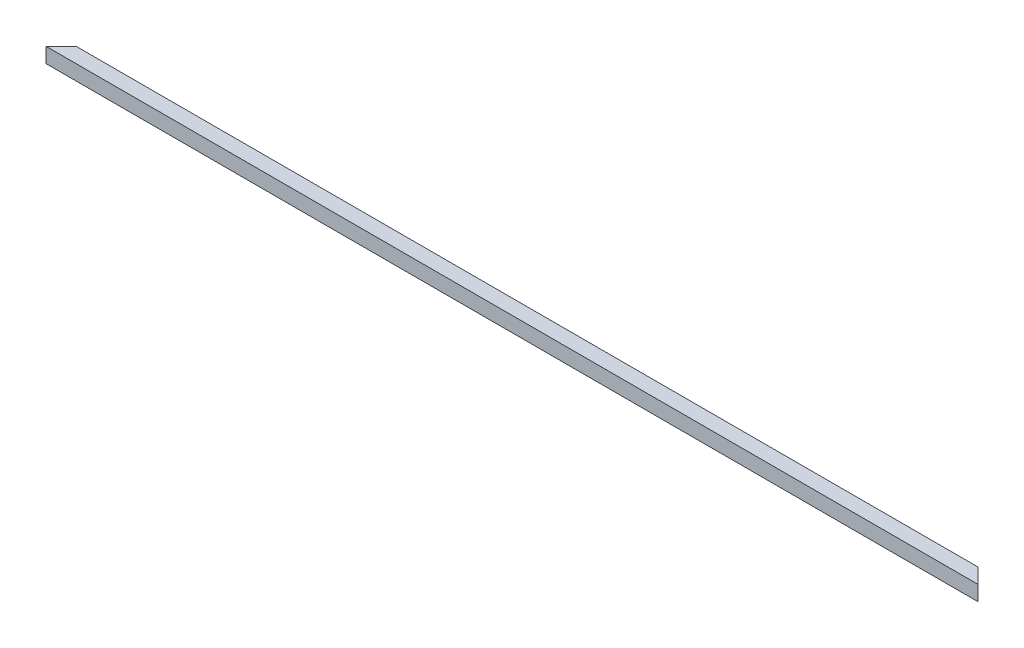
ISO-10303-21;
HEADER;
FILE_DESCRIPTION(('STEP AP214'),'2;1');
FILE_NAME('part.step','',(''),(''),'','','');
FILE_SCHEMA(('AUTOMOTIVE_DESIGN { 1 0 10303 214 1 1 1 1 }'));
ENDSEC;
DATA;
#1=APPLICATION_CONTEXT('core data for automotive mechanical design processes');
#2=APPLICATION_PROTOCOL_DEFINITION('international standard','automotive_design',2000,#1);
#3=PRODUCT_CONTEXT('',#1,'mechanical');
#4=PRODUCT('Part','Part','',(#3));
#5=PRODUCT_RELATED_PRODUCT_CATEGORY('part','',(#4));
#6=PRODUCT_DEFINITION_FORMATION('','',#4);
#7=PRODUCT_DEFINITION_CONTEXT('part definition',#1,'design');
#8=PRODUCT_DEFINITION('design','',#6,#7);
#9=PRODUCT_DEFINITION_SHAPE('','',#8);
#10=(LENGTH_UNIT() NAMED_UNIT(*) SI_UNIT(.MILLI.,.METRE.));
#11=(NAMED_UNIT(*) PLANE_ANGLE_UNIT() SI_UNIT($,.RADIAN.));
#12=(NAMED_UNIT(*) SI_UNIT($,.STERADIAN.) SOLID_ANGLE_UNIT());
#13=UNCERTAINTY_MEASURE_WITH_UNIT(LENGTH_MEASURE(1.E-05),#10,'distance_accuracy_value','');
#14=(GEOMETRIC_REPRESENTATION_CONTEXT(3) GLOBAL_UNCERTAINTY_ASSIGNED_CONTEXT((#13)) GLOBAL_UNIT_ASSIGNED_CONTEXT((#10,
#11,#12)) REPRESENTATION_CONTEXT('',''));
#15=CARTESIAN_POINT('',(0.,0.,0.));
#16=DIRECTION('',(0.,0.,1.));
#17=DIRECTION('',(1.,0.,0.));
#18=AXIS2_PLACEMENT_3D('',#15,#16,#17);
#19=CARTESIAN_POINT('',(1574.8,-12.7,-12.7));
#20=DIRECTION('',(0.,0.,1.));
#21=DIRECTION('',(1.,0.,0.));
#22=AXIS2_PLACEMENT_3D('',#19,#20,#21);
#23=PLANE('',#22);
#24=DIRECTION('',(0.,1.,0.));
#25=VECTOR('',#24,1.);
#26=CARTESIAN_POINT('',(1549.4,-12.7,-12.7));
#27=LINE('',#26,#25);
#28=CARTESIAN_POINT('',(1549.4,-12.7,-12.7));
#29=VERTEX_POINT('',#28);
#30=CARTESIAN_POINT('',(1549.4,12.7,-12.7));
#31=VERTEX_POINT('',#30);
#32=EDGE_CURVE('E98',#29,#31,#27,.T.);
#33=ORIENTED_EDGE('',*,*,#32,.F.);
#34=DIRECTION('',(-1.,0.,0.));
#35=VECTOR('',#34,1.);
#36=CARTESIAN_POINT('',(1574.8,-12.7,-12.7));
#37=LINE('',#36,#35);
#38=CARTESIAN_POINT('',(25.4000000000005,-12.7,-12.7000000000001));
#39=VERTEX_POINT('',#38);
#40=EDGE_CURVE('E53',#29,#39,#37,.T.);
#41=ORIENTED_EDGE('',*,*,#40,.T.);
#42=DIRECTION('',(0.,1.,0.));
#43=VECTOR('',#42,1.);
#44=CARTESIAN_POINT('',(25.4,-12.7,-12.7));
#45=LINE('',#44,#43);
#46=CARTESIAN_POINT('',(25.4,12.7,-12.7));
#47=VERTEX_POINT('',#46);
#48=EDGE_CURVE('E165',#39,#47,#45,.T.);
#49=ORIENTED_EDGE('',*,*,#48,.T.);
#50=DIRECTION('',(-1.,0.,0.));
#51=VECTOR('',#50,1.);
#52=CARTESIAN_POINT('',(1574.8,12.7,-12.7));
#53=LINE('',#52,#51);
#54=EDGE_CURVE('E108',#31,#47,#53,.T.);
#55=ORIENTED_EDGE('',*,*,#54,.F.);
#56=EDGE_LOOP('',(#33,#41,#49,#55));
#57=FACE_BOUND('',#56,.T.);
#58=ADVANCED_FACE('F32',(#57),#23,.F.);
#59=CARTESIAN_POINT('',(1574.8,12.7,12.7));
#60=DIRECTION('',(0.,-1.,0.));
#61=DIRECTION('',(0.,0.,-1.));
#62=AXIS2_PLACEMENT_3D('',#59,#60,#61);
#63=PLANE('',#62);
#64=DIRECTION('',(-0.707106781186547,0.,-0.707106781186547));
#65=VECTOR('',#64,1.);
#66=CARTESIAN_POINT('',(1574.8,12.7,12.7));
#67=LINE('',#66,#65);
#68=CARTESIAN_POINT('',(1574.8,12.7,12.7));
#69=VERTEX_POINT('',#68);
#70=EDGE_CURVE('E105',#69,#31,#67,.T.);
#71=ORIENTED_EDGE('',*,*,#70,.T.);
#72=ORIENTED_EDGE('',*,*,#54,.T.);
#73=DIRECTION('',(0.707106781186547,0.,-0.707106781186547));
#74=VECTOR('',#73,1.);
#75=CARTESIAN_POINT('',(0.,12.7,12.7));
#76=LINE('',#75,#74);
#77=CARTESIAN_POINT('',(0.,12.7,12.7));
#78=VERTEX_POINT('',#77);
#79=EDGE_CURVE('E161',#78,#47,#76,.T.);
#80=ORIENTED_EDGE('',*,*,#79,.F.);
#81=DIRECTION('',(-1.,0.,0.));
#82=VECTOR('',#81,1.);
#83=CARTESIAN_POINT('',(1574.8,12.7,12.7));
#84=LINE('',#83,#82);
#85=EDGE_CURVE('E116',#69,#78,#84,.T.);
#86=ORIENTED_EDGE('',*,*,#85,.F.);
#87=EDGE_LOOP('',(#71,#72,#80,#86));
#88=FACE_BOUND('',#87,.T.);
#89=ADVANCED_FACE('F163',(#88),#63,.F.);
#90=CARTESIAN_POINT('',(1574.8,-12.7,12.7));
#91=DIRECTION('',(0.,1.,0.));
#92=DIRECTION('',(0.,0.,1.));
#93=AXIS2_PLACEMENT_3D('',#90,#91,#92);
#94=PLANE('',#93);
#95=DIRECTION('',(-0.707106781186547,0.,-0.707106781186547));
#96=VECTOR('',#95,1.);
#97=CARTESIAN_POINT('',(1574.8,-12.7,12.7));
#98=LINE('',#97,#96);
#99=CARTESIAN_POINT('',(1574.8,-12.7,12.7));
#100=VERTEX_POINT('',#99);
#101=EDGE_CURVE('E96',#100,#29,#98,.T.);
#102=ORIENTED_EDGE('',*,*,#101,.F.);
#103=DIRECTION('',(-1.,0.,0.));
#104=VECTOR('',#103,1.);
#105=CARTESIAN_POINT('',(1574.8,-12.7,12.7));
#106=LINE('',#105,#104);
#107=CARTESIAN_POINT('',(0.,-12.7,12.7));
#108=VERTEX_POINT('',#107);
#109=EDGE_CURVE('E114',#100,#108,#106,.T.);
#110=ORIENTED_EDGE('',*,*,#109,.T.);
#111=DIRECTION('',(0.707106781186547,0.,-0.707106781186547));
#112=VECTOR('',#111,1.);
#113=CARTESIAN_POINT('',(0.,-12.7,12.7));
#114=LINE('',#113,#112);
#115=EDGE_CURVE('E113',#108,#39,#114,.T.);
#116=ORIENTED_EDGE('',*,*,#115,.T.);
#117=ORIENTED_EDGE('',*,*,#40,.F.);
#118=EDGE_LOOP('',(#102,#110,#116,#117));
#119=FACE_BOUND('',#118,.T.);
#120=ADVANCED_FACE('F112',(#119),#94,.F.);
#121=CARTESIAN_POINT('',(1574.8,-11.1125,-11.1125));
#122=DIRECTION('',(0.,0.,1.));
#123=DIRECTION('',(1.,0.,0.));
#124=AXIS2_PLACEMENT_3D('',#121,#122,#123);
#125=PLANE('',#124);
#126=DIRECTION('',(-1.,0.,0.));
#127=VECTOR('',#126,1.);
#128=CARTESIAN_POINT('',(1574.8,-11.1125,-11.1125));
#129=LINE('',#128,#127);
#130=CARTESIAN_POINT('',(1550.9875,-11.1125,-11.1125));
#131=VERTEX_POINT('',#130);
#132=CARTESIAN_POINT('',(23.8124999999998,-11.1125,-11.1125));
#133=VERTEX_POINT('',#132);
#134=EDGE_CURVE('E142',#131,#133,#129,.T.);
#135=ORIENTED_EDGE('',*,*,#134,.F.);
#136=DIRECTION('',(0.,1.,0.));
#137=VECTOR('',#136,1.);
#138=CARTESIAN_POINT('',(1550.9875,-11.1125,-11.1125));
#139=LINE('',#138,#137);
#140=CARTESIAN_POINT('',(1550.9875,11.1125,-11.1125));
#141=VERTEX_POINT('',#140);
#142=EDGE_CURVE('E46',#131,#141,#139,.T.);
#143=ORIENTED_EDGE('',*,*,#142,.T.);
#144=DIRECTION('',(-1.,0.,0.));
#145=VECTOR('',#144,1.);
#146=CARTESIAN_POINT('',(1574.8,11.1125,-11.1125));
#147=LINE('',#146,#145);
#148=CARTESIAN_POINT('',(23.8124999999998,11.1125,-11.1125));
#149=VERTEX_POINT('',#148);
#150=EDGE_CURVE('E144',#141,#149,#147,.T.);
#151=ORIENTED_EDGE('',*,*,#150,.T.);
#152=DIRECTION('',(0.,1.,0.));
#153=VECTOR('',#152,1.);
#154=CARTESIAN_POINT('',(23.8124999999998,-11.1125,-11.1125));
#155=LINE('',#154,#153);
#156=EDGE_CURVE('E133',#133,#149,#155,.T.);
#157=ORIENTED_EDGE('',*,*,#156,.F.);
#158=EDGE_LOOP('',(#135,#143,#151,#157));
#159=FACE_BOUND('',#158,.T.);
#160=ADVANCED_FACE('F141',(#159),#125,.T.);
#161=CARTESIAN_POINT('',(1574.8,11.1125,11.1125));
#162=DIRECTION('',(0.,-1.,0.));
#163=DIRECTION('',(0.,0.,-1.));
#164=AXIS2_PLACEMENT_3D('',#161,#162,#163);
#165=PLANE('',#164);
#166=ORIENTED_EDGE('',*,*,#150,.F.);
#167=DIRECTION('',(0.707106781186548,0.,0.707106781186548));
#168=VECTOR('',#167,1.);
#169=CARTESIAN_POINT('',(1574.00625,11.1125,11.90625));
#170=LINE('',#169,#168);
#171=CARTESIAN_POINT('',(1573.2125,11.1125,11.1125));
#172=VERTEX_POINT('',#171);
#173=EDGE_CURVE('E167',#141,#172,#170,.T.);
#174=ORIENTED_EDGE('',*,*,#173,.T.);
#175=DIRECTION('',(-1.,0.,0.));
#176=VECTOR('',#175,1.);
#177=CARTESIAN_POINT('',(1574.8,11.1125,11.1125));
#178=LINE('',#177,#176);
#179=CARTESIAN_POINT('',(1.58749999999985,11.1125,11.1125));
#180=VERTEX_POINT('',#179);
#181=EDGE_CURVE('E153',#172,#180,#178,.T.);
#182=ORIENTED_EDGE('',*,*,#181,.T.);
#183=DIRECTION('',(-0.707106781186548,0.,0.707106781186548));
#184=VECTOR('',#183,1.);
#185=CARTESIAN_POINT('',(788.19375,11.1125,-775.49375));
#186=LINE('',#185,#184);
#187=EDGE_CURVE('E145',#149,#180,#186,.T.);
#188=ORIENTED_EDGE('',*,*,#187,.F.);
#189=EDGE_LOOP('',(#166,#174,#182,#188));
#190=FACE_BOUND('',#189,.T.);
#191=ADVANCED_FACE('F198',(#190),#165,.T.);
#192=CARTESIAN_POINT('',(1574.8,-11.1125,11.1125));
#193=DIRECTION('',(0.,0.,-1.));
#194=DIRECTION('',(0.,1.,0.));
#195=AXIS2_PLACEMENT_3D('',#192,#193,#194);
#196=PLANE('',#195);
#197=ORIENTED_EDGE('',*,*,#181,.F.);
#198=DIRECTION('',(0.,-1.,0.));
#199=VECTOR('',#198,1.);
#200=CARTESIAN_POINT('',(1573.2125,-11.1125,11.1125));
#201=LINE('',#200,#199);
#202=CARTESIAN_POINT('',(1573.2125,-11.1125,11.1125));
#203=VERTEX_POINT('',#202);
#204=EDGE_CURVE('E109',#172,#203,#201,.T.);
#205=ORIENTED_EDGE('',*,*,#204,.T.);
#206=DIRECTION('',(-1.,0.,0.));
#207=VECTOR('',#206,1.);
#208=CARTESIAN_POINT('',(1574.8,-11.1125,11.1125));
#209=LINE('',#208,#207);
#210=CARTESIAN_POINT('',(1.58750000000007,-11.1125,11.1125));
#211=VERTEX_POINT('',#210);
#212=EDGE_CURVE('E147',#203,#211,#209,.T.);
#213=ORIENTED_EDGE('',*,*,#212,.T.);
#214=DIRECTION('',(0.,-1.,0.));
#215=VECTOR('',#214,1.);
#216=CARTESIAN_POINT('',(1.58749999999985,-11.1124999999999,11.1125));
#217=LINE('',#216,#215);
#218=EDGE_CURVE('E136',#180,#211,#217,.T.);
#219=ORIENTED_EDGE('',*,*,#218,.F.);
#220=EDGE_LOOP('',(#197,#205,#213,#219));
#221=FACE_BOUND('',#220,.T.);
#222=ADVANCED_FACE('F177',(#221),#196,.T.);
#223=CARTESIAN_POINT('',(1574.8,-11.1125,11.1125));
#224=DIRECTION('',(0.,1.,0.));
#225=DIRECTION('',(0.,0.,1.));
#226=AXIS2_PLACEMENT_3D('',#223,#224,#225);
#227=PLANE('',#226);
#228=ORIENTED_EDGE('',*,*,#212,.F.);
#229=DIRECTION('',(-0.707106781186548,0.,-0.707106781186548));
#230=VECTOR('',#229,1.);
#231=CARTESIAN_POINT('',(1574.00625,-11.1125,11.90625));
#232=LINE('',#231,#230);
#233=EDGE_CURVE('E11',#203,#131,#232,.T.);
#234=ORIENTED_EDGE('',*,*,#233,.T.);
#235=ORIENTED_EDGE('',*,*,#134,.T.);
#236=DIRECTION('',(0.707106781186548,0.,-0.707106781186548));
#237=VECTOR('',#236,1.);
#238=CARTESIAN_POINT('',(788.19375,-11.1125,-775.49375));
#239=LINE('',#238,#237);
#240=EDGE_CURVE('E39',#211,#133,#239,.T.);
#241=ORIENTED_EDGE('',*,*,#240,.F.);
#242=EDGE_LOOP('',(#228,#234,#235,#241));
#243=FACE_BOUND('',#242,.T.);
#244=ADVANCED_FACE('F178',(#243),#227,.T.);
#245=CARTESIAN_POINT('',(1574.8,-12.7,12.7));
#246=DIRECTION('',(0.,0.,-1.));
#247=DIRECTION('',(-1.,0.,0.));
#248=AXIS2_PLACEMENT_3D('',#245,#246,#247);
#249=PLANE('',#248);
#250=DIRECTION('',(0.,-1.,0.));
#251=VECTOR('',#250,1.);
#252=CARTESIAN_POINT('',(0.,-12.7,12.7));
#253=LINE('',#252,#251);
#254=EDGE_CURVE('E118',#78,#108,#253,.T.);
#255=ORIENTED_EDGE('',*,*,#254,.T.);
#256=ORIENTED_EDGE('',*,*,#109,.F.);
#257=DIRECTION('',(0.,-1.,0.));
#258=VECTOR('',#257,1.);
#259=CARTESIAN_POINT('',(1574.8,-12.7,12.7));
#260=LINE('',#259,#258);
#261=EDGE_CURVE('E101',#69,#100,#260,.T.);
#262=ORIENTED_EDGE('',*,*,#261,.F.);
#263=ORIENTED_EDGE('',*,*,#85,.T.);
#264=EDGE_LOOP('',(#255,#256,#262,#263));
#265=FACE_BOUND('',#264,.T.);
#266=ADVANCED_FACE('F157',(#265),#249,.F.);
#267=CARTESIAN_POINT('',(0.,-12.7,12.7));
#268=DIRECTION('',(0.707106781186548,0.,0.707106781186548));
#269=DIRECTION('',(0.707106781186548,0.,-0.707106781186548));
#270=AXIS2_PLACEMENT_3D('',#267,#268,#269);
#271=PLANE('',#270);
#272=ORIENTED_EDGE('',*,*,#156,.T.);
#273=ORIENTED_EDGE('',*,*,#187,.T.);
#274=ORIENTED_EDGE('',*,*,#218,.T.);
#275=ORIENTED_EDGE('',*,*,#240,.T.);
#276=EDGE_LOOP('',(#272,#273,#274,#275));
#277=FACE_BOUND('',#276,.T.);
#278=ORIENTED_EDGE('',*,*,#79,.T.);
#279=ORIENTED_EDGE('',*,*,#48,.F.);
#280=ORIENTED_EDGE('',*,*,#115,.F.);
#281=ORIENTED_EDGE('',*,*,#254,.F.);
#282=EDGE_LOOP('',(#278,#279,#280,#281));
#283=FACE_BOUND('',#282,.T.);
#284=ADVANCED_FACE('F130',(#277,#283),#271,.F.);
#285=CARTESIAN_POINT('',(1574.8,-12.7,12.7));
#286=DIRECTION('',(0.707106781186548,0.,-0.707106781186548));
#287=DIRECTION('',(-0.707106781186548,0.,-0.707106781186548));
#288=AXIS2_PLACEMENT_3D('',#285,#286,#287);
#289=PLANE('',#288);
#290=ORIENTED_EDGE('',*,*,#233,.F.);
#291=ORIENTED_EDGE('',*,*,#204,.F.);
#292=ORIENTED_EDGE('',*,*,#173,.F.);
#293=ORIENTED_EDGE('',*,*,#142,.F.);
#294=EDGE_LOOP('',(#290,#291,#292,#293));
#295=FACE_BOUND('',#294,.T.);
#296=ORIENTED_EDGE('',*,*,#70,.F.);
#297=ORIENTED_EDGE('',*,*,#261,.T.);
#298=ORIENTED_EDGE('',*,*,#101,.T.);
#299=ORIENTED_EDGE('',*,*,#32,.T.);
#300=EDGE_LOOP('',(#296,#297,#298,#299));
#301=FACE_BOUND('',#300,.T.);
#302=ADVANCED_FACE('F97',(#295,#301),#289,.T.);
#303=CLOSED_SHELL('',(#58,#89,#120,#160,#191,#222,#244,#266,#284,#302));
#304=MANIFOLD_SOLID_BREP('B2',#303);
#305=ADVANCED_BREP_SHAPE_REPRESENTATION('',(#18,#304),#14);
#306=SHAPE_DEFINITION_REPRESENTATION(#9,#305);
ENDSEC;
END-ISO-10303-21;
